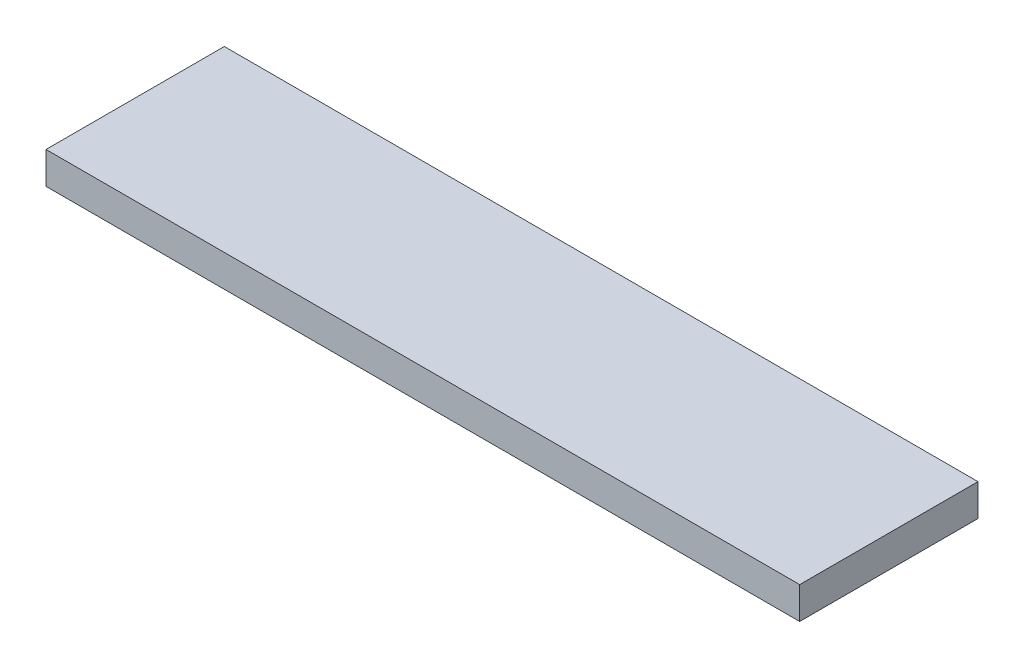
ISO-10303-21;
HEADER;
FILE_DESCRIPTION(('STEP AP214'),'2;1');
FILE_NAME('part.step','',(''),(''),'','','');
FILE_SCHEMA(('AUTOMOTIVE_DESIGN { 1 0 10303 214 1 1 1 1 }'));
ENDSEC;
DATA;
#1=APPLICATION_CONTEXT('core data for automotive mechanical design processes');
#2=APPLICATION_PROTOCOL_DEFINITION('international standard','automotive_design',2000,#1);
#3=PRODUCT_CONTEXT('',#1,'mechanical');
#4=PRODUCT('Part','Part','',(#3));
#5=PRODUCT_RELATED_PRODUCT_CATEGORY('part','',(#4));
#6=PRODUCT_DEFINITION_FORMATION('','',#4);
#7=PRODUCT_DEFINITION_CONTEXT('part definition',#1,'design');
#8=PRODUCT_DEFINITION('design','',#6,#7);
#9=PRODUCT_DEFINITION_SHAPE('','',#8);
#10=(LENGTH_UNIT() NAMED_UNIT(*) SI_UNIT(.MILLI.,.METRE.));
#11=(NAMED_UNIT(*) PLANE_ANGLE_UNIT() SI_UNIT($,.RADIAN.));
#12=(NAMED_UNIT(*) SI_UNIT($,.STERADIAN.) SOLID_ANGLE_UNIT());
#13=UNCERTAINTY_MEASURE_WITH_UNIT(LENGTH_MEASURE(1.E-05),#10,'distance_accuracy_value','');
#14=(GEOMETRIC_REPRESENTATION_CONTEXT(3) GLOBAL_UNCERTAINTY_ASSIGNED_CONTEXT((#13)) GLOBAL_UNIT_ASSIGNED_CONTEXT((#10,
#11,#12)) REPRESENTATION_CONTEXT('',''));
#15=CARTESIAN_POINT('',(0.,0.,0.));
#16=DIRECTION('',(0.,0.,1.));
#17=DIRECTION('',(1.,0.,0.));
#18=AXIS2_PLACEMENT_3D('',#15,#16,#17);
#19=CARTESIAN_POINT('',(0.,9.5,0.));
#20=DIRECTION('',(1.,0.,0.));
#21=DIRECTION('',(0.,0.,-1.));
#22=AXIS2_PLACEMENT_3D('',#19,#20,#21);
#23=PLANE('',#22);
#24=DIRECTION('',(0.,0.,1.));
#25=VECTOR('',#24,1.);
#26=CARTESIAN_POINT('',(0.,0.,0.));
#27=LINE('',#26,#25);
#28=CARTESIAN_POINT('',(0.,0.,0.));
#29=VERTEX_POINT('',#28);
#30=CARTESIAN_POINT('',(0.,0.,53.));
#31=VERTEX_POINT('',#30);
#32=EDGE_CURVE('E98',#29,#31,#27,.T.);
#33=ORIENTED_EDGE('',*,*,#32,.T.);
#34=DIRECTION('',(0.,-1.,0.));
#35=VECTOR('',#34,1.);
#36=CARTESIAN_POINT('',(0.,9.5,53.));
#37=LINE('',#36,#35);
#38=CARTESIAN_POINT('',(0.,9.5,53.));
#39=VERTEX_POINT('',#38);
#40=EDGE_CURVE('E11',#39,#31,#37,.T.);
#41=ORIENTED_EDGE('',*,*,#40,.F.);
#42=DIRECTION('',(0.,0.,1.));
#43=VECTOR('',#42,1.);
#44=CARTESIAN_POINT('',(0.,9.5,0.));
#45=LINE('',#44,#43);
#46=CARTESIAN_POINT('',(0.,9.5,0.));
#47=VERTEX_POINT('',#46);
#48=EDGE_CURVE('E86',#47,#39,#45,.T.);
#49=ORIENTED_EDGE('',*,*,#48,.F.);
#50=DIRECTION('',(0.,-1.,0.));
#51=VECTOR('',#50,1.);
#52=CARTESIAN_POINT('',(0.,9.5,0.));
#53=LINE('',#52,#51);
#54=EDGE_CURVE('E94',#47,#29,#53,.T.);
#55=ORIENTED_EDGE('',*,*,#54,.T.);
#56=EDGE_LOOP('',(#33,#41,#49,#55));
#57=FACE_BOUND('',#56,.T.);
#58=ADVANCED_FACE('F35',(#57),#23,.F.);
#59=CARTESIAN_POINT('',(0.,9.5,53.));
#60=DIRECTION('',(0.,0.,-1.));
#61=DIRECTION('',(-1.,0.,0.));
#62=AXIS2_PLACEMENT_3D('',#59,#60,#61);
#63=PLANE('',#62);
#64=DIRECTION('',(1.,0.,0.));
#65=VECTOR('',#64,1.);
#66=CARTESIAN_POINT('',(0.,0.,53.));
#67=LINE('',#66,#65);
#68=CARTESIAN_POINT('',(224.,0.,53.));
#69=VERTEX_POINT('',#68);
#70=EDGE_CURVE('E90',#31,#69,#67,.T.);
#71=ORIENTED_EDGE('',*,*,#70,.T.);
#72=DIRECTION('',(0.,-1.,0.));
#73=VECTOR('',#72,1.);
#74=CARTESIAN_POINT('',(224.,9.5,53.));
#75=LINE('',#74,#73);
#76=CARTESIAN_POINT('',(224.,9.5,53.));
#77=VERTEX_POINT('',#76);
#78=EDGE_CURVE('E43',#77,#69,#75,.T.);
#79=ORIENTED_EDGE('',*,*,#78,.F.);
#80=DIRECTION('',(1.,0.,0.));
#81=VECTOR('',#80,1.);
#82=CARTESIAN_POINT('',(0.,9.5,53.));
#83=LINE('',#82,#81);
#84=EDGE_CURVE('E81',#39,#77,#83,.T.);
#85=ORIENTED_EDGE('',*,*,#84,.F.);
#86=ORIENTED_EDGE('',*,*,#40,.T.);
#87=EDGE_LOOP('',(#71,#79,#85,#86));
#88=FACE_BOUND('',#87,.T.);
#89=ADVANCED_FACE('F89',(#88),#63,.F.);
#90=CARTESIAN_POINT('',(224.,9.5,0.));
#91=DIRECTION('',(-1.,0.,0.));
#92=DIRECTION('',(0.,0.,1.));
#93=AXIS2_PLACEMENT_3D('',#90,#91,#92);
#94=PLANE('',#93);
#95=DIRECTION('',(0.,0.,-1.));
#96=VECTOR('',#95,1.);
#97=CARTESIAN_POINT('',(224.,0.,0.));
#98=LINE('',#97,#96);
#99=CARTESIAN_POINT('',(224.,0.,0.));
#100=VERTEX_POINT('',#99);
#101=EDGE_CURVE('E68',#69,#100,#98,.T.);
#102=ORIENTED_EDGE('',*,*,#101,.T.);
#103=DIRECTION('',(0.,-1.,0.));
#104=VECTOR('',#103,1.);
#105=CARTESIAN_POINT('',(224.,9.5,0.));
#106=LINE('',#105,#104);
#107=CARTESIAN_POINT('',(224.,9.5,0.));
#108=VERTEX_POINT('',#107);
#109=EDGE_CURVE('E91',#108,#100,#106,.T.);
#110=ORIENTED_EDGE('',*,*,#109,.F.);
#111=DIRECTION('',(0.,0.,-1.));
#112=VECTOR('',#111,1.);
#113=CARTESIAN_POINT('',(224.,9.5,0.));
#114=LINE('',#113,#112);
#115=EDGE_CURVE('E84',#77,#108,#114,.T.);
#116=ORIENTED_EDGE('',*,*,#115,.F.);
#117=ORIENTED_EDGE('',*,*,#78,.T.);
#118=EDGE_LOOP('',(#102,#110,#116,#117));
#119=FACE_BOUND('',#118,.T.);
#120=ADVANCED_FACE('F92',(#119),#94,.F.);
#121=CARTESIAN_POINT('',(0.,9.5,0.));
#122=DIRECTION('',(0.,0.,1.));
#123=DIRECTION('',(1.,0.,0.));
#124=AXIS2_PLACEMENT_3D('',#121,#122,#123);
#125=PLANE('',#124);
#126=DIRECTION('',(-1.,0.,0.));
#127=VECTOR('',#126,1.);
#128=CARTESIAN_POINT('',(0.,0.,0.));
#129=LINE('',#128,#127);
#130=EDGE_CURVE('E74',#100,#29,#129,.T.);
#131=ORIENTED_EDGE('',*,*,#130,.T.);
#132=ORIENTED_EDGE('',*,*,#54,.F.);
#133=DIRECTION('',(-1.,0.,0.));
#134=VECTOR('',#133,1.);
#135=CARTESIAN_POINT('',(0.,9.5,0.));
#136=LINE('',#135,#134);
#137=EDGE_CURVE('E51',#108,#47,#136,.T.);
#138=ORIENTED_EDGE('',*,*,#137,.F.);
#139=ORIENTED_EDGE('',*,*,#109,.T.);
#140=EDGE_LOOP('',(#131,#132,#138,#139));
#141=FACE_BOUND('',#140,.T.);
#142=ADVANCED_FACE('F105',(#141),#125,.F.);
#143=CARTESIAN_POINT('',(0.,9.5,0.));
#144=DIRECTION('',(0.,1.,0.));
#145=DIRECTION('',(0.,0.,1.));
#146=AXIS2_PLACEMENT_3D('',#143,#144,#145);
#147=PLANE('',#146);
#148=ORIENTED_EDGE('',*,*,#48,.T.);
#149=ORIENTED_EDGE('',*,*,#84,.T.);
#150=ORIENTED_EDGE('',*,*,#115,.T.);
#151=ORIENTED_EDGE('',*,*,#137,.T.);
#152=EDGE_LOOP('',(#148,#149,#150,#151));
#153=FACE_BOUND('',#152,.T.);
#154=ADVANCED_FACE('F82',(#153),#147,.T.);
#155=CARTESIAN_POINT('',(0.,0.,0.));
#156=DIRECTION('',(0.,1.,0.));
#157=DIRECTION('',(0.,0.,1.));
#158=AXIS2_PLACEMENT_3D('',#155,#156,#157);
#159=PLANE('',#158);
#160=ORIENTED_EDGE('',*,*,#32,.F.);
#161=ORIENTED_EDGE('',*,*,#130,.F.);
#162=ORIENTED_EDGE('',*,*,#101,.F.);
#163=ORIENTED_EDGE('',*,*,#70,.F.);
#164=EDGE_LOOP('',(#160,#161,#162,#163));
#165=FACE_BOUND('',#164,.T.);
#166=ADVANCED_FACE('F108',(#165),#159,.F.);
#167=CLOSED_SHELL('',(#58,#89,#120,#142,#154,#166));
#168=MANIFOLD_SOLID_BREP('B2',#167);
#169=ADVANCED_BREP_SHAPE_REPRESENTATION('',(#18,#168),#14);
#170=SHAPE_DEFINITION_REPRESENTATION(#9,#169);
ENDSEC;
END-ISO-10303-21;
